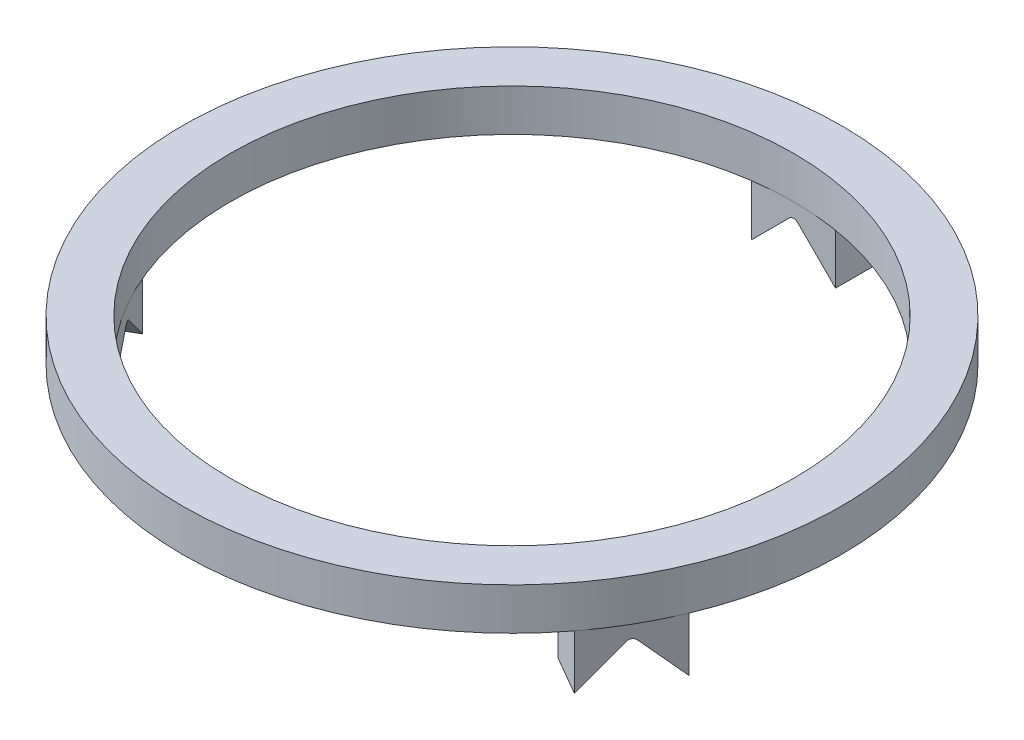
ISO-10303-21;
HEADER;
FILE_DESCRIPTION(('STEP AP214'),'2;1');
FILE_NAME('part.step','',(''),(''),'','','');
FILE_SCHEMA(('AUTOMOTIVE_DESIGN { 1 0 10303 214 1 1 1 1 }'));
ENDSEC;
DATA;
#1=APPLICATION_CONTEXT('core data for automotive mechanical design processes');
#2=APPLICATION_PROTOCOL_DEFINITION('international standard','automotive_design',2000,#1);
#3=PRODUCT_CONTEXT('',#1,'mechanical');
#4=PRODUCT('Part','Part','',(#3));
#5=PRODUCT_RELATED_PRODUCT_CATEGORY('part','',(#4));
#6=PRODUCT_DEFINITION_FORMATION('','',#4);
#7=PRODUCT_DEFINITION_CONTEXT('part definition',#1,'design');
#8=PRODUCT_DEFINITION('design','',#6,#7);
#9=PRODUCT_DEFINITION_SHAPE('','',#8);
#10=(LENGTH_UNIT() NAMED_UNIT(*) SI_UNIT(.MILLI.,.METRE.));
#11=(NAMED_UNIT(*) PLANE_ANGLE_UNIT() SI_UNIT($,.RADIAN.));
#12=(NAMED_UNIT(*) SI_UNIT($,.STERADIAN.) SOLID_ANGLE_UNIT());
#13=UNCERTAINTY_MEASURE_WITH_UNIT(LENGTH_MEASURE(1.E-05),#10,'distance_accuracy_value','');
#14=(GEOMETRIC_REPRESENTATION_CONTEXT(3) GLOBAL_UNCERTAINTY_ASSIGNED_CONTEXT((#13)) GLOBAL_UNIT_ASSIGNED_CONTEXT((#10,
#11,#12)) REPRESENTATION_CONTEXT('',''));
#15=CARTESIAN_POINT('',(0.,0.,0.));
#16=DIRECTION('',(0.,0.,1.));
#17=DIRECTION('',(1.,0.,0.));
#18=AXIS2_PLACEMENT_3D('',#15,#16,#17);
#19=CARTESIAN_POINT('',(0.,0.,0.));
#20=DIRECTION('',(0.,1.,0.));
#21=DIRECTION('',(0.,0.,1.));
#22=AXIS2_PLACEMENT_3D('',#19,#20,#21);
#23=PLANE('',#22);
#24=DIRECTION('',(0.866025403784442,0.,0.499999999999994));
#25=VECTOR('',#24,1.);
#26=CARTESIAN_POINT('',(12.888987999994,0.,5.38840313413997));
#27=LINE('',#26,#25);
#28=CARTESIAN_POINT('',(11.2276112703787,0.,4.42920683207116));
#29=VERTEX_POINT('',#28);
#30=CARTESIAN_POINT('',(12.888987999994,0.,5.38840313413997));
#31=VERTEX_POINT('',#30);
#32=EDGE_CURVE('E329',#29,#31,#27,.T.);
#33=ORIENTED_EDGE('',*,*,#32,.F.);
#34=DIRECTION('',(0.499999999999992,0.,-0.866025403784443));
#35=VECTOR('',#34,1.);
#36=CARTESIAN_POINT('',(10.3386112703787,0.,5.9689999999999));
#37=LINE('',#36,#35);
#38=CARTESIAN_POINT('',(10.3386112703787,0.,5.9689999999999));
#39=VERTEX_POINT('',#38);
#40=EDGE_CURVE('E335',#39,#29,#37,.T.);
#41=ORIENTED_EDGE('',*,*,#40,.F.);
#42=CARTESIAN_POINT('',(0.,0.,0.));
#43=DIRECTION('',(0.,1.,0.));
#44=DIRECTION('',(0.,0.,1.));
#45=AXIS2_PLACEMENT_3D('',#42,#43,#44);
#46=CIRCLE('',#45,11.938);
#47=CARTESIAN_POINT('',(0.,0.,-11.938));
#48=VERTEX_POINT('',#47);
#49=EDGE_CURVE('E268',#39,#48,#46,.T.);
#50=ORIENTED_EDGE('',*,*,#49,.T.);
#51=DIRECTION('',(-1.,0.,0.));
#52=VECTOR('',#51,1.);
#53=CARTESIAN_POINT('',(0.,0.,-11.938));
#54=LINE('',#53,#52);
#55=CARTESIAN_POINT('',(1.778,0.,-11.938));
#56=VERTEX_POINT('',#55);
#57=EDGE_CURVE('E243',#56,#48,#54,.T.);
#58=ORIENTED_EDGE('',*,*,#57,.F.);
#59=DIRECTION('',(0.,0.,1.));
#60=VECTOR('',#59,1.);
#61=CARTESIAN_POINT('',(1.778,0.,-11.938));
#62=LINE('',#61,#60);
#63=CARTESIAN_POINT('',(1.778,0.,-13.8563926041376));
#64=VERTEX_POINT('',#63);
#65=EDGE_CURVE('E251',#64,#56,#62,.T.);
#66=ORIENTED_EDGE('',*,*,#65,.F.);
#67=CARTESIAN_POINT('',(0.,0.,0.));
#68=DIRECTION('',(0.,1.,0.));
#69=DIRECTION('',(0.,0.,1.));
#70=AXIS2_PLACEMENT_3D('',#67,#68,#69);
#71=CIRCLE('',#70,13.97);
#72=EDGE_CURVE('E272',#31,#64,#71,.T.);
#73=ORIENTED_EDGE('',*,*,#72,.F.);
#74=EDGE_LOOP('',(#33,#41,#50,#58,#66,#73));
#75=FACE_BOUND('',#74,.T.);
#76=ADVANCED_FACE('F34',(#75),#23,.F.);
#77=DIRECTION('',(-0.499999999999992,0.,0.866025403784443));
#78=VECTOR('',#77,1.);
#79=CARTESIAN_POINT('',(11.1109879999941,0.,8.46798946999744));
#80=LINE('',#79,#78);
#81=CARTESIAN_POINT('',(11.1109879999941,0.,8.46798946999744));
#82=VERTEX_POINT('',#81);
#83=EDGE_CURVE('E333',#31,#82,#80,.T.);
#84=ORIENTED_EDGE('',*,*,#83,.F.);
#85=EDGE_CURVE('E429',#82,#31,#71,.T.);
#86=ORIENTED_EDGE('',*,*,#85,.F.);
#87=EDGE_LOOP('',(#84,#86));
#88=FACE_BOUND('',#87,.T.);
#89=ADVANCED_FACE('F402',(#88),#23,.F.);
#90=DIRECTION('',(-0.866025403784443,0.,-0.499999999999992));
#91=VECTOR('',#90,1.);
#92=CARTESIAN_POINT('',(9.4496112703787,0.,7.50879316792864));
#93=LINE('',#92,#91);
#94=CARTESIAN_POINT('',(9.44961127037869,0.,7.50879316792864));
#95=VERTEX_POINT('',#94);
#96=EDGE_CURVE('E184',#82,#95,#93,.T.);
#97=ORIENTED_EDGE('',*,*,#96,.F.);
#98=CARTESIAN_POINT('',(-11.110987999994,0.,8.46798946999756));
#99=VERTEX_POINT('',#98);
#100=EDGE_CURVE('E428',#99,#82,#71,.T.);
#101=ORIENTED_EDGE('',*,*,#100,.F.);
#102=DIRECTION('',(-0.866025403784438,0.,0.500000000000002));
#103=VECTOR('',#102,1.);
#104=CARTESIAN_POINT('',(-11.110987999994,0.,8.4679894699976));
#105=LINE('',#104,#103);
#106=CARTESIAN_POINT('',(-9.4496112703786,0.,7.50879316792878));
#107=VERTEX_POINT('',#106);
#108=EDGE_CURVE('E198',#107,#99,#105,.T.);
#109=ORIENTED_EDGE('',*,*,#108,.F.);
#110=DIRECTION('',(0.500000000000004,0.,0.866025403784436));
#111=VECTOR('',#110,1.);
#112=CARTESIAN_POINT('',(-10.3386112703786,0.,5.96900000000005));
#113=LINE('',#112,#111);
#114=CARTESIAN_POINT('',(-10.3386112703786,0.,5.96900000000005));
#115=VERTEX_POINT('',#114);
#116=EDGE_CURVE('E214',#115,#107,#113,.T.);
#117=ORIENTED_EDGE('',*,*,#116,.F.);
#118=EDGE_CURVE('E276',#115,#39,#46,.T.);
#119=ORIENTED_EDGE('',*,*,#118,.T.);
#120=EDGE_CURVE('E190',#95,#39,#37,.T.);
#121=ORIENTED_EDGE('',*,*,#120,.F.);
#122=EDGE_LOOP('',(#97,#101,#109,#117,#119,#121));
#123=FACE_BOUND('',#122,.T.);
#124=ADVANCED_FACE('F338',(#123),#23,.F.);
#125=DIRECTION('',(-0.500000000000004,0.,-0.866025403784436));
#126=VECTOR('',#125,1.);
#127=CARTESIAN_POINT('',(-12.888987999994,0.,5.38840313414014));
#128=LINE('',#127,#126);
#129=CARTESIAN_POINT('',(-12.888987999994,0.,5.38840313414014));
#130=VERTEX_POINT('',#129);
#131=EDGE_CURVE('E208',#99,#130,#128,.T.);
#132=ORIENTED_EDGE('',*,*,#131,.F.);
#133=EDGE_CURVE('E375',#130,#99,#71,.T.);
#134=ORIENTED_EDGE('',*,*,#133,.F.);
#135=EDGE_LOOP('',(#132,#134));
#136=FACE_BOUND('',#135,.T.);
#137=ADVANCED_FACE('F417',(#136),#23,.F.);
#138=DIRECTION('',(0.866025403784436,0.,-0.500000000000004));
#139=VECTOR('',#138,1.);
#140=CARTESIAN_POINT('',(-11.2276112703786,0.,4.42920683207132));
#141=LINE('',#140,#139);
#142=CARTESIAN_POINT('',(-11.2276112703786,0.,4.42920683207132));
#143=VERTEX_POINT('',#142);
#144=EDGE_CURVE('E211',#130,#143,#141,.T.);
#145=ORIENTED_EDGE('',*,*,#144,.F.);
#146=CARTESIAN_POINT('',(-1.778,0.,-13.8563926041376));
#147=VERTEX_POINT('',#146);
#148=EDGE_CURVE('E283',#147,#130,#71,.T.);
#149=ORIENTED_EDGE('',*,*,#148,.F.);
#150=DIRECTION('',(0.,0.,-1.));
#151=VECTOR('',#150,1.);
#152=CARTESIAN_POINT('',(-1.778,0.,-13.8563926041376));
#153=LINE('',#152,#151);
#154=CARTESIAN_POINT('',(-1.778,0.,-11.938));
#155=VERTEX_POINT('',#154);
#156=EDGE_CURVE('E238',#155,#147,#153,.T.);
#157=ORIENTED_EDGE('',*,*,#156,.F.);
#158=EDGE_CURVE('E256',#48,#155,#54,.T.);
#159=ORIENTED_EDGE('',*,*,#158,.F.);
#160=EDGE_CURVE('E273',#48,#115,#46,.T.);
#161=ORIENTED_EDGE('',*,*,#160,.T.);
#162=EDGE_CURVE('E203',#143,#115,#113,.T.);
#163=ORIENTED_EDGE('',*,*,#162,.F.);
#164=EDGE_LOOP('',(#145,#149,#157,#159,#161,#163));
#165=FACE_BOUND('',#164,.T.);
#166=ADVANCED_FACE('F351',(#165),#23,.F.);
#167=DIRECTION('',(1.,0.,0.));
#168=VECTOR('',#167,1.);
#169=CARTESIAN_POINT('',(1.778,0.,-13.8563926041376));
#170=LINE('',#169,#168);
#171=EDGE_CURVE('E248',#147,#64,#170,.T.);
#172=ORIENTED_EDGE('',*,*,#171,.F.);
#173=EDGE_CURVE('E280',#64,#147,#71,.T.);
#174=ORIENTED_EDGE('',*,*,#173,.F.);
#175=EDGE_LOOP('',(#172,#174));
#176=FACE_BOUND('',#175,.T.);
#177=ADVANCED_FACE('F370',(#176),#23,.F.);
#178=CARTESIAN_POINT('',(0.,1.778,0.));
#179=DIRECTION('',(0.,1.,0.));
#180=DIRECTION('',(0.,0.,1.));
#181=AXIS2_PLACEMENT_3D('',#178,#179,#180);
#182=PLANE('',#181);
#183=CARTESIAN_POINT('',(0.,1.778,0.));
#184=DIRECTION('',(0.,1.,0.));
#185=DIRECTION('',(0.,0.,1.));
#186=AXIS2_PLACEMENT_3D('',#183,#184,#185);
#187=CIRCLE('',#186,13.97);
#188=CARTESIAN_POINT('',(0.,1.778,13.97));
#189=VERTEX_POINT('',#188);
#190=EDGE_CURVE('E277',#189,#189,#187,.T.);
#191=ORIENTED_EDGE('',*,*,#190,.T.);
#192=EDGE_LOOP('',(#191));
#193=FACE_BOUND('',#192,.T.);
#194=CARTESIAN_POINT('',(0.,1.778,0.));
#195=DIRECTION('',(0.,1.,0.));
#196=DIRECTION('',(0.,0.,1.));
#197=AXIS2_PLACEMENT_3D('',#194,#195,#196);
#198=CIRCLE('',#197,11.938);
#199=CARTESIAN_POINT('',(0.,1.778,11.938));
#200=VERTEX_POINT('',#199);
#201=EDGE_CURVE('E269',#200,#200,#198,.T.);
#202=ORIENTED_EDGE('',*,*,#201,.F.);
#203=EDGE_LOOP('',(#202));
#204=FACE_BOUND('',#203,.T.);
#205=ADVANCED_FACE('F411',(#193,#204),#182,.T.);
#206=CARTESIAN_POINT('',(0.,1.778,0.));
#207=DIRECTION('',(0.,-1.,0.));
#208=DIRECTION('',(0.,0.,-1.));
#209=AXIS2_PLACEMENT_3D('',#206,#207,#208);
#210=CYLINDRICAL_SURFACE('',#209,13.97);
#211=ORIENTED_EDGE('',*,*,#190,.F.);
#212=EDGE_LOOP('',(#211));
#213=FACE_BOUND('',#212,.T.);
#214=ORIENTED_EDGE('',*,*,#173,.T.);
#215=ORIENTED_EDGE('',*,*,#148,.T.);
#216=ORIENTED_EDGE('',*,*,#133,.T.);
#217=ORIENTED_EDGE('',*,*,#100,.T.);
#218=ORIENTED_EDGE('',*,*,#85,.T.);
#219=ORIENTED_EDGE('',*,*,#72,.T.);
#220=EDGE_LOOP('',(#214,#215,#216,#217,#218,#219));
#221=FACE_BOUND('',#220,.T.);
#222=ADVANCED_FACE('F376',(#213,#221),#210,.T.);
#223=CARTESIAN_POINT('',(0.,1.778,0.));
#224=DIRECTION('',(0.,-1.,0.));
#225=DIRECTION('',(0.,0.,-1.));
#226=AXIS2_PLACEMENT_3D('',#223,#224,#225);
#227=CYLINDRICAL_SURFACE('',#226,11.938);
#228=ORIENTED_EDGE('',*,*,#201,.T.);
#229=EDGE_LOOP('',(#228));
#230=FACE_BOUND('',#229,.T.);
#231=ORIENTED_EDGE('',*,*,#160,.F.);
#232=ORIENTED_EDGE('',*,*,#49,.F.);
#233=ORIENTED_EDGE('',*,*,#118,.F.);
#234=EDGE_LOOP('',(#231,#232,#233));
#235=FACE_BOUND('',#234,.T.);
#236=ADVANCED_FACE('F355',(#230,#235),#227,.F.);
#237=CARTESIAN_POINT('',(-1.778,-2.286,-13.8563926041376));
#238=DIRECTION('',(1.,0.,0.));
#239=DIRECTION('',(0.,0.,-1.));
#240=AXIS2_PLACEMENT_3D('',#237,#238,#239);
#241=PLANE('',#240);
#242=ORIENTED_EDGE('',*,*,#156,.T.);
#243=DIRECTION('',(0.,1.,0.));
#244=VECTOR('',#243,1.);
#245=CARTESIAN_POINT('',(-1.778,-2.286,-13.8563926041376));
#246=LINE('',#245,#244);
#247=CARTESIAN_POINT('',(-1.778,-2.286,-13.8563926041376));
#248=VERTEX_POINT('',#247);
#249=EDGE_CURVE('E262',#248,#147,#246,.T.);
#250=ORIENTED_EDGE('',*,*,#249,.F.);
#251=DIRECTION('',(0.,0.,-1.));
#252=VECTOR('',#251,1.);
#253=CARTESIAN_POINT('',(-1.778,-2.286,-13.8563926041376));
#254=LINE('',#253,#252);
#255=CARTESIAN_POINT('',(-1.778,-2.286,-11.938));
#256=VERTEX_POINT('',#255);
#257=EDGE_CURVE('E239',#256,#248,#254,.T.);
#258=ORIENTED_EDGE('',*,*,#257,.F.);
#259=DIRECTION('',(0.,1.,0.));
#260=VECTOR('',#259,1.);
#261=CARTESIAN_POINT('',(-1.778,-2.286,-11.938));
#262=LINE('',#261,#260);
#263=EDGE_CURVE('E265',#256,#155,#262,.T.);
#264=ORIENTED_EDGE('',*,*,#263,.T.);
#265=EDGE_LOOP('',(#242,#250,#258,#264));
#266=FACE_BOUND('',#265,.T.);
#267=ADVANCED_FACE('F378',(#266),#241,.F.);
#268=CARTESIAN_POINT('',(1.778,-2.286,-13.8563926041376));
#269=DIRECTION('',(0.,0.,1.));
#270=DIRECTION('',(1.,0.,0.));
#271=AXIS2_PLACEMENT_3D('',#268,#269,#270);
#272=PLANE('',#271);
#273=DIRECTION('',(-0.707106781186546,0.707106781186549,0.));
#274=VECTOR('',#273,1.);
#275=CARTESIAN_POINT('',(1.778,-2.286,-13.8563926041376));
#276=LINE('',#275,#274);
#277=CARTESIAN_POINT('',(1.778,-2.286,-13.8563926041376));
#278=VERTEX_POINT('',#277);
#279=CARTESIAN_POINT('',(0.179605122421383,-0.687605122421378,-13.8563926041376));
#280=VERTEX_POINT('',#279);
#281=EDGE_CURVE('E233',#278,#280,#276,.T.);
#282=ORIENTED_EDGE('',*,*,#281,.T.);
#283=CARTESIAN_POINT('',(0.,-0.86721024484276,-13.8563926041376));
#284=DIRECTION('',(0.,0.,1.));
#285=DIRECTION('',(1.,0.,0.));
#286=AXIS2_PLACEMENT_3D('',#283,#284,#285);
#287=CIRCLE('',#286,0.254);
#288=CARTESIAN_POINT('',(-0.179605122421383,-0.687605122421378,-13.8563926041376));
#289=VERTEX_POINT('',#288);
#290=EDGE_CURVE('E291',#280,#289,#287,.T.);
#291=ORIENTED_EDGE('',*,*,#290,.T.);
#292=DIRECTION('',(-0.707106781186546,-0.707106781186549,0.));
#293=VECTOR('',#292,1.);
#294=CARTESIAN_POINT('',(0.,-0.508,-13.8563926041376));
#295=LINE('',#294,#293);
#296=EDGE_CURVE('E236',#289,#248,#295,.T.);
#297=ORIENTED_EDGE('',*,*,#296,.T.);
#298=ORIENTED_EDGE('',*,*,#249,.T.);
#299=ORIENTED_EDGE('',*,*,#171,.T.);
#300=DIRECTION('',(0.,1.,0.));
#301=VECTOR('',#300,1.);
#302=CARTESIAN_POINT('',(1.778,-2.286,-13.8563926041376));
#303=LINE('',#302,#301);
#304=EDGE_CURVE('E259',#278,#64,#303,.T.);
#305=ORIENTED_EDGE('',*,*,#304,.F.);
#306=EDGE_LOOP('',(#282,#291,#297,#298,#299,#305));
#307=FACE_BOUND('',#306,.T.);
#308=ADVANCED_FACE('F366',(#307),#272,.F.);
#309=CARTESIAN_POINT('',(1.778,-2.286,-11.938));
#310=DIRECTION('',(-1.,0.,0.));
#311=DIRECTION('',(0.,0.,1.));
#312=AXIS2_PLACEMENT_3D('',#309,#310,#311);
#313=PLANE('',#312);
#314=ORIENTED_EDGE('',*,*,#65,.T.);
#315=DIRECTION('',(0.,1.,0.));
#316=VECTOR('',#315,1.);
#317=CARTESIAN_POINT('',(1.778,-2.286,-11.938));
#318=LINE('',#317,#316);
#319=CARTESIAN_POINT('',(1.778,-2.286,-11.938));
#320=VERTEX_POINT('',#319);
#321=EDGE_CURVE('E245',#320,#56,#318,.T.);
#322=ORIENTED_EDGE('',*,*,#321,.F.);
#323=DIRECTION('',(0.,0.,1.));
#324=VECTOR('',#323,1.);
#325=CARTESIAN_POINT('',(1.778,-2.286,-11.938));
#326=LINE('',#325,#324);
#327=EDGE_CURVE('E242',#278,#320,#326,.T.);
#328=ORIENTED_EDGE('',*,*,#327,.F.);
#329=ORIENTED_EDGE('',*,*,#304,.T.);
#330=EDGE_LOOP('',(#314,#322,#328,#329));
#331=FACE_BOUND('',#330,.T.);
#332=ADVANCED_FACE('F361',(#331),#313,.F.);
#333=CARTESIAN_POINT('',(0.,-2.286,-11.938));
#334=DIRECTION('',(0.,0.,-1.));
#335=DIRECTION('',(-1.,0.,0.));
#336=AXIS2_PLACEMENT_3D('',#333,#334,#335);
#337=PLANE('',#336);
#338=ORIENTED_EDGE('',*,*,#263,.F.);
#339=DIRECTION('',(-0.707106781186546,-0.707106781186549,0.));
#340=VECTOR('',#339,1.);
#341=CARTESIAN_POINT('',(-1.778,-2.286,-11.938));
#342=LINE('',#341,#340);
#343=CARTESIAN_POINT('',(-0.179605122421383,-0.687605122421378,-11.938));
#344=VERTEX_POINT('',#343);
#345=EDGE_CURVE('E231',#344,#256,#342,.T.);
#346=ORIENTED_EDGE('',*,*,#345,.F.);
#347=CARTESIAN_POINT('',(0.,-0.86721024484276,-11.938));
#348=DIRECTION('',(0.,0.,-1.));
#349=DIRECTION('',(-1.,0.,0.));
#350=AXIS2_PLACEMENT_3D('',#347,#348,#349);
#351=CIRCLE('',#350,0.254);
#352=CARTESIAN_POINT('',(0.179605122421383,-0.687605122421378,-11.938));
#353=VERTEX_POINT('',#352);
#354=EDGE_CURVE('E289',#344,#353,#351,.T.);
#355=ORIENTED_EDGE('',*,*,#354,.T.);
#356=DIRECTION('',(-0.707106781186546,0.707106781186549,0.));
#357=VECTOR('',#356,1.);
#358=CARTESIAN_POINT('',(0.,-0.507999999999994,-11.938));
#359=LINE('',#358,#357);
#360=EDGE_CURVE('E228',#320,#353,#359,.T.);
#361=ORIENTED_EDGE('',*,*,#360,.F.);
#362=ORIENTED_EDGE('',*,*,#321,.T.);
#363=ORIENTED_EDGE('',*,*,#57,.T.);
#364=ORIENTED_EDGE('',*,*,#158,.T.);
#365=EDGE_LOOP('',(#338,#346,#355,#361,#362,#363,#364));
#366=FACE_BOUND('',#365,.T.);
#367=ADVANCED_FACE('F356',(#366),#337,.F.);
#368=CARTESIAN_POINT('',(-1.778,-2.286,-14.478));
#369=DIRECTION('',(-0.707106781186549,0.707106781186546,0.));
#370=DIRECTION('',(-0.707106781186546,-0.707106781186549,0.));
#371=AXIS2_PLACEMENT_3D('',#368,#369,#370);
#372=PLANE('',#371);
#373=ORIENTED_EDGE('',*,*,#296,.F.);
#374=DIRECTION('',(0.,0.,1.));
#375=VECTOR('',#374,1.);
#376=CARTESIAN_POINT('',(-0.179605122421383,-0.687605122421378,-11.938));
#377=LINE('',#376,#375);
#378=EDGE_CURVE('E284',#289,#344,#377,.T.);
#379=ORIENTED_EDGE('',*,*,#378,.T.);
#380=ORIENTED_EDGE('',*,*,#345,.T.);
#381=ORIENTED_EDGE('',*,*,#257,.T.);
#382=EDGE_LOOP('',(#373,#379,#380,#381));
#383=FACE_BOUND('',#382,.T.);
#384=ADVANCED_FACE('F383',(#383),#372,.F.);
#385=CARTESIAN_POINT('',(0.,-0.507999999999994,-14.478));
#386=DIRECTION('',(0.707106781186549,0.707106781186546,0.));
#387=DIRECTION('',(-0.707106781186546,0.707106781186549,0.));
#388=AXIS2_PLACEMENT_3D('',#385,#386,#387);
#389=PLANE('',#388);
#390=ORIENTED_EDGE('',*,*,#360,.T.);
#391=DIRECTION('',(0.,0.,1.));
#392=VECTOR('',#391,1.);
#393=CARTESIAN_POINT('',(0.179605122421383,-0.687605122421378,-13.8563926041376));
#394=LINE('',#393,#392);
#395=EDGE_CURVE('E287',#353,#280,#394,.F.);
#396=ORIENTED_EDGE('',*,*,#395,.T.);
#397=ORIENTED_EDGE('',*,*,#281,.F.);
#398=ORIENTED_EDGE('',*,*,#327,.T.);
#399=EDGE_LOOP('',(#390,#396,#397,#398));
#400=FACE_BOUND('',#399,.T.);
#401=ADVANCED_FACE('F390',(#400),#389,.F.);
#402=CARTESIAN_POINT('',(0.,-0.86721024484276,-14.478));
#403=DIRECTION('',(0.,0.,-1.));
#404=DIRECTION('',(-1.,0.,0.));
#405=AXIS2_PLACEMENT_3D('',#402,#403,#404);
#406=CYLINDRICAL_SURFACE('',#405,0.254);
#407=ORIENTED_EDGE('',*,*,#290,.F.);
#408=ORIENTED_EDGE('',*,*,#395,.F.);
#409=ORIENTED_EDGE('',*,*,#354,.F.);
#410=ORIENTED_EDGE('',*,*,#378,.F.);
#411=EDGE_LOOP('',(#407,#408,#409,#410));
#412=FACE_BOUND('',#411,.T.);
#413=ADVANCED_FACE('F387',(#412),#406,.F.);
#414=CARTESIAN_POINT('',(-11.110987999994,-2.286,8.4679894699976));
#415=DIRECTION('',(-0.500000000000002,0.,-0.866025403784438));
#416=DIRECTION('',(-0.866025403784438,0.,0.500000000000002));
#417=AXIS2_PLACEMENT_3D('',#414,#415,#416);
#418=PLANE('',#417);
#419=ORIENTED_EDGE('',*,*,#108,.T.);
#420=DIRECTION('',(0.,1.,0.));
#421=VECTOR('',#420,1.);
#422=CARTESIAN_POINT('',(-11.110987999994,-2.286,8.4679894699976));
#423=LINE('',#422,#421);
#424=CARTESIAN_POINT('',(-11.110987999994,-2.286,8.4679894699976));
#425=VERTEX_POINT('',#424);
#426=EDGE_CURVE('E222',#425,#99,#423,.T.);
#427=ORIENTED_EDGE('',*,*,#426,.F.);
#428=DIRECTION('',(-0.866025403784438,0.,0.500000000000002));
#429=VECTOR('',#428,1.);
#430=CARTESIAN_POINT('',(-11.110987999994,-2.286,8.4679894699976));
#431=LINE('',#430,#429);
#432=CARTESIAN_POINT('',(-9.4496112703786,-2.286,7.50879316792878));
#433=VERTEX_POINT('',#432);
#434=EDGE_CURVE('E199',#433,#425,#431,.T.);
#435=ORIENTED_EDGE('',*,*,#434,.F.);
#436=DIRECTION('',(0.,1.,0.));
#437=VECTOR('',#436,1.);
#438=CARTESIAN_POINT('',(-9.4496112703786,-2.286,7.50879316792878));
#439=LINE('',#438,#437);
#440=EDGE_CURVE('E225',#433,#107,#439,.T.);
#441=ORIENTED_EDGE('',*,*,#440,.T.);
#442=EDGE_LOOP('',(#419,#427,#435,#441));
#443=FACE_BOUND('',#442,.T.);
#444=ADVANCED_FACE('F397',(#443),#418,.F.);
#445=CARTESIAN_POINT('',(-12.888987999994,-2.286,5.38840313414014));
#446=DIRECTION('',(0.866025403784436,0.,-0.500000000000004));
#447=DIRECTION('',(-0.500000000000004,0.,-0.866025403784436));
#448=AXIS2_PLACEMENT_3D('',#445,#446,#447);
#449=PLANE('',#448);
#450=DIRECTION('',(0.353553390593276,0.707106781186549,0.612372435695792));
#451=VECTOR('',#450,1.);
#452=CARTESIAN_POINT('',(-12.888987999994,-2.286,5.38840313414014));
#453=LINE('',#452,#451);
#454=CARTESIAN_POINT('',(-12.888987999994,-2.286,5.38840313414014));
#455=VERTEX_POINT('',#454);
#456=CARTESIAN_POINT('',(-12.0897905612047,-0.687605122421378,6.77265370340214));
#457=VERTEX_POINT('',#456);
#458=EDGE_CURVE('E324',#455,#457,#453,.T.);
#459=ORIENTED_EDGE('',*,*,#458,.T.);
#460=CARTESIAN_POINT('',(-11.999987999994,-0.867210244842761,6.92819630206887));
#461=DIRECTION('',(0.866025403784436,0.,-0.500000000000004));
#462=DIRECTION('',(-0.500000000000004,0.,-0.866025403784436));
#463=AXIS2_PLACEMENT_3D('',#460,#461,#462);
#464=CIRCLE('',#463,0.254);
#465=CARTESIAN_POINT('',(-11.9101854387833,-0.687605122421378,7.0837389007356));
#466=VERTEX_POINT('',#465);
#467=EDGE_CURVE('E300',#457,#466,#464,.T.);
#468=ORIENTED_EDGE('',*,*,#467,.T.);
#469=DIRECTION('',(0.353553390593276,-0.707106781186549,0.612372435695792));
#470=VECTOR('',#469,1.);
#471=CARTESIAN_POINT('',(-11.999987999994,-0.507999999999999,6.92819630206888));
#472=LINE('',#471,#470);
#473=EDGE_CURVE('E327',#466,#425,#472,.T.);
#474=ORIENTED_EDGE('',*,*,#473,.T.);
#475=ORIENTED_EDGE('',*,*,#426,.T.);
#476=ORIENTED_EDGE('',*,*,#131,.T.);
#477=DIRECTION('',(0.,1.,0.));
#478=VECTOR('',#477,1.);
#479=CARTESIAN_POINT('',(-12.888987999994,-2.286,5.38840313414014));
#480=LINE('',#479,#478);
#481=EDGE_CURVE('E219',#455,#130,#480,.T.);
#482=ORIENTED_EDGE('',*,*,#481,.F.);
#483=EDGE_LOOP('',(#459,#468,#474,#475,#476,#482));
#484=FACE_BOUND('',#483,.T.);
#485=ADVANCED_FACE('F434',(#484),#449,.F.);
#486=CARTESIAN_POINT('',(-11.2276112703786,-2.286,4.42920683207132));
#487=DIRECTION('',(0.500000000000004,0.,0.866025403784436));
#488=DIRECTION('',(0.866025403784436,0.,-0.500000000000004));
#489=AXIS2_PLACEMENT_3D('',#486,#487,#488);
#490=PLANE('',#489);
#491=ORIENTED_EDGE('',*,*,#144,.T.);
#492=DIRECTION('',(0.,1.,0.));
#493=VECTOR('',#492,1.);
#494=CARTESIAN_POINT('',(-11.2276112703786,-2.286,4.42920683207132));
#495=LINE('',#494,#493);
#496=CARTESIAN_POINT('',(-11.2276112703786,-2.286,4.42920683207132));
#497=VERTEX_POINT('',#496);
#498=EDGE_CURVE('E205',#497,#143,#495,.T.);
#499=ORIENTED_EDGE('',*,*,#498,.F.);
#500=DIRECTION('',(0.866025403784436,0.,-0.500000000000004));
#501=VECTOR('',#500,1.);
#502=CARTESIAN_POINT('',(-11.2276112703786,-2.286,4.42920683207132));
#503=LINE('',#502,#501);
#504=EDGE_CURVE('E202',#455,#497,#503,.T.);
#505=ORIENTED_EDGE('',*,*,#504,.F.);
#506=ORIENTED_EDGE('',*,*,#481,.T.);
#507=EDGE_LOOP('',(#491,#499,#505,#506));
#508=FACE_BOUND('',#507,.T.);
#509=ADVANCED_FACE('F446',(#508),#490,.F.);
#510=CARTESIAN_POINT('',(-10.3386112703786,-2.286,5.96900000000005));
#511=DIRECTION('',(-0.866025403784436,0.,0.500000000000004));
#512=DIRECTION('',(0.500000000000004,0.,0.866025403784436));
#513=AXIS2_PLACEMENT_3D('',#510,#511,#512);
#514=PLANE('',#513);
#515=ORIENTED_EDGE('',*,*,#440,.F.);
#516=DIRECTION('',(0.353553390593276,-0.707106781186549,0.612372435695792));
#517=VECTOR('',#516,1.);
#518=CARTESIAN_POINT('',(-9.4496112703786,-2.286,7.50879316792878));
#519=LINE('',#518,#517);
#520=CARTESIAN_POINT('',(-10.2488087091679,-0.687605122421377,6.12454259866678));
#521=VERTEX_POINT('',#520);
#522=EDGE_CURVE('E322',#521,#433,#519,.T.);
#523=ORIENTED_EDGE('',*,*,#522,.F.);
#524=CARTESIAN_POINT('',(-10.3386112703786,-0.867210244842761,5.96900000000005));
#525=DIRECTION('',(-0.866025403784436,0.,0.500000000000004));
#526=DIRECTION('',(0.500000000000004,0.,0.866025403784436));
#527=AXIS2_PLACEMENT_3D('',#524,#525,#526);
#528=CIRCLE('',#527,0.254);
#529=CARTESIAN_POINT('',(-10.4284138315893,-0.687605122421378,5.81345740133332));
#530=VERTEX_POINT('',#529);
#531=EDGE_CURVE('E298',#521,#530,#528,.T.);
#532=ORIENTED_EDGE('',*,*,#531,.T.);
#533=DIRECTION('',(0.353553390593276,0.707106781186549,0.612372435695792));
#534=VECTOR('',#533,1.);
#535=CARTESIAN_POINT('',(-10.3386112703786,-0.507999999999994,5.96900000000005));
#536=LINE('',#535,#534);
#537=EDGE_CURVE('E319',#497,#530,#536,.T.);
#538=ORIENTED_EDGE('',*,*,#537,.F.);
#539=ORIENTED_EDGE('',*,*,#498,.T.);
#540=ORIENTED_EDGE('',*,*,#162,.T.);
#541=ORIENTED_EDGE('',*,*,#116,.T.);
#542=EDGE_LOOP('',(#515,#523,#532,#538,#539,#540,#541));
#543=FACE_BOUND('',#542,.T.);
#544=ADVANCED_FACE('F442',(#543),#514,.F.);
#545=CARTESIAN_POINT('',(12.888987999994,-2.286,5.38840313413997));
#546=DIRECTION('',(-0.499999999999994,0.,0.866025403784442));
#547=DIRECTION('',(0.866025403784442,0.,0.499999999999994));
#548=AXIS2_PLACEMENT_3D('',#545,#546,#547);
#549=PLANE('',#548);
#550=ORIENTED_EDGE('',*,*,#32,.T.);
#551=DIRECTION('',(0.,1.,0.));
#552=VECTOR('',#551,1.);
#553=CARTESIAN_POINT('',(12.888987999994,-2.286,5.38840313413997));
#554=LINE('',#553,#552);
#555=CARTESIAN_POINT('',(12.888987999994,-2.286,5.38840313413996));
#556=VERTEX_POINT('',#555);
#557=EDGE_CURVE('E187',#556,#31,#554,.T.);
#558=ORIENTED_EDGE('',*,*,#557,.F.);
#559=DIRECTION('',(0.866025403784442,0.,0.499999999999994));
#560=VECTOR('',#559,1.);
#561=CARTESIAN_POINT('',(12.888987999994,-2.286,5.38840313413997));
#562=LINE('',#561,#560);
#563=CARTESIAN_POINT('',(11.2276112703787,-2.286,4.42920683207116));
#564=VERTEX_POINT('',#563);
#565=EDGE_CURVE('E174',#564,#556,#562,.T.);
#566=ORIENTED_EDGE('',*,*,#565,.F.);
#567=DIRECTION('',(0.,1.,0.));
#568=VECTOR('',#567,1.);
#569=CARTESIAN_POINT('',(11.2276112703787,-2.286,4.42920683207116));
#570=LINE('',#569,#568);
#571=EDGE_CURVE('E195',#564,#29,#570,.T.);
#572=ORIENTED_EDGE('',*,*,#571,.T.);
#573=EDGE_LOOP('',(#550,#558,#566,#572));
#574=FACE_BOUND('',#573,.T.);
#575=ADVANCED_FACE('F470',(#574),#549,.F.);
#576=CARTESIAN_POINT('',(11.1109879999941,-2.286,8.46798946999744));
#577=DIRECTION('',(-0.866025403784443,0.,-0.499999999999992));
#578=DIRECTION('',(-0.499999999999992,0.,0.866025403784443));
#579=AXIS2_PLACEMENT_3D('',#576,#577,#578);
#580=PLANE('',#579);
#581=DIRECTION('',(0.353553390593267,0.707106781186549,-0.612372435695797));
#582=VECTOR('',#581,1.);
#583=CARTESIAN_POINT('',(11.1109879999941,-2.286,8.46798946999744));
#584=LINE('',#583,#582);
#585=CARTESIAN_POINT('',(11.1109879999941,-2.286,8.46798946999744));
#586=VERTEX_POINT('',#585);
#587=CARTESIAN_POINT('',(11.9101854387834,-0.687605122421378,7.08373890073544));
#588=VERTEX_POINT('',#587);
#589=EDGE_CURVE('E168',#586,#588,#584,.T.);
#590=ORIENTED_EDGE('',*,*,#589,.T.);
#591=CARTESIAN_POINT('',(11.9999879999941,-0.867210244842761,6.9281963020687));
#592=DIRECTION('',(-0.866025403784443,0.,-0.499999999999992));
#593=DIRECTION('',(-0.499999999999992,0.,0.866025403784443));
#594=AXIS2_PLACEMENT_3D('',#591,#592,#593);
#595=CIRCLE('',#594,0.254);
#596=CARTESIAN_POINT('',(12.0897905612048,-0.687605122421378,6.77265370340197));
#597=VERTEX_POINT('',#596);
#598=EDGE_CURVE('E11',#588,#597,#595,.T.);
#599=ORIENTED_EDGE('',*,*,#598,.T.);
#600=DIRECTION('',(0.353553390593267,-0.707106781186549,-0.612372435695797));
#601=VECTOR('',#600,1.);
#602=CARTESIAN_POINT('',(11.9999879999941,-0.508,6.9281963020687));
#603=LINE('',#602,#601);
#604=EDGE_CURVE('E311',#597,#556,#603,.T.);
#605=ORIENTED_EDGE('',*,*,#604,.T.);
#606=ORIENTED_EDGE('',*,*,#557,.T.);
#607=ORIENTED_EDGE('',*,*,#83,.T.);
#608=DIRECTION('',(0.,1.,0.));
#609=VECTOR('',#608,1.);
#610=CARTESIAN_POINT('',(11.1109879999941,-2.286,8.46798946999744));
#611=LINE('',#610,#609);
#612=EDGE_CURVE('E185',#586,#82,#611,.T.);
#613=ORIENTED_EDGE('',*,*,#612,.F.);
#614=EDGE_LOOP('',(#590,#599,#605,#606,#607,#613));
#615=FACE_BOUND('',#614,.T.);
#616=ADVANCED_FACE('F467',(#615),#580,.F.);
#617=CARTESIAN_POINT('',(9.4496112703787,-2.286,7.50879316792864));
#618=DIRECTION('',(0.499999999999992,0.,-0.866025403784443));
#619=DIRECTION('',(-0.866025403784443,0.,-0.499999999999992));
#620=AXIS2_PLACEMENT_3D('',#617,#618,#619);
#621=PLANE('',#620);
#622=ORIENTED_EDGE('',*,*,#96,.T.);
#623=DIRECTION('',(0.,1.,0.));
#624=VECTOR('',#623,1.);
#625=CARTESIAN_POINT('',(9.4496112703787,-2.286,7.50879316792864));
#626=LINE('',#625,#624);
#627=CARTESIAN_POINT('',(9.4496112703787,-2.286,7.50879316792864));
#628=VERTEX_POINT('',#627);
#629=EDGE_CURVE('E173',#628,#95,#626,.T.);
#630=ORIENTED_EDGE('',*,*,#629,.F.);
#631=DIRECTION('',(-0.866025403784443,0.,-0.499999999999992));
#632=VECTOR('',#631,1.);
#633=CARTESIAN_POINT('',(9.4496112703787,-2.286,7.50879316792864));
#634=LINE('',#633,#632);
#635=EDGE_CURVE('E165',#586,#628,#634,.T.);
#636=ORIENTED_EDGE('',*,*,#635,.F.);
#637=ORIENTED_EDGE('',*,*,#612,.T.);
#638=EDGE_LOOP('',(#622,#630,#636,#637));
#639=FACE_BOUND('',#638,.T.);
#640=ADVANCED_FACE('F183',(#639),#621,.F.);
#641=CARTESIAN_POINT('',(10.3386112703787,-2.286,5.9689999999999));
#642=DIRECTION('',(0.866025403784443,0.,0.499999999999992));
#643=DIRECTION('',(0.499999999999992,0.,-0.866025403784443));
#644=AXIS2_PLACEMENT_3D('',#641,#642,#643);
#645=PLANE('',#644);
#646=ORIENTED_EDGE('',*,*,#571,.F.);
#647=DIRECTION('',(0.353553390593267,-0.707106781186549,-0.612372435695797));
#648=VECTOR('',#647,1.);
#649=CARTESIAN_POINT('',(11.2276112703787,-2.286,4.42920683207116));
#650=LINE('',#649,#648);
#651=CARTESIAN_POINT('',(10.4284138315894,-0.687605122421379,5.81345740133317));
#652=VERTEX_POINT('',#651);
#653=EDGE_CURVE('E180',#652,#564,#650,.T.);
#654=ORIENTED_EDGE('',*,*,#653,.F.);
#655=CARTESIAN_POINT('',(10.3386112703787,-0.867210244842761,5.9689999999999));
#656=DIRECTION('',(0.866025403784443,0.,0.499999999999992));
#657=DIRECTION('',(0.499999999999992,0.,-0.866025403784443));
#658=AXIS2_PLACEMENT_3D('',#655,#656,#657);
#659=CIRCLE('',#658,0.254);
#660=CARTESIAN_POINT('',(10.248808709168,-0.687605122421378,6.12454259866664));
#661=VERTEX_POINT('',#660);
#662=EDGE_CURVE('E42',#652,#661,#659,.T.);
#663=ORIENTED_EDGE('',*,*,#662,.T.);
#664=DIRECTION('',(0.353553390593267,0.707106781186549,-0.612372435695797));
#665=VECTOR('',#664,1.);
#666=CARTESIAN_POINT('',(10.3386112703787,-0.507999999999994,5.9689999999999));
#667=LINE('',#666,#665);
#668=EDGE_CURVE('E167',#628,#661,#667,.T.);
#669=ORIENTED_EDGE('',*,*,#668,.F.);
#670=ORIENTED_EDGE('',*,*,#629,.T.);
#671=ORIENTED_EDGE('',*,*,#120,.T.);
#672=ORIENTED_EDGE('',*,*,#40,.T.);
#673=EDGE_LOOP('',(#646,#654,#663,#669,#670,#671,#672));
#674=FACE_BOUND('',#673,.T.);
#675=ADVANCED_FACE('F178',(#674),#645,.F.);
#676=CARTESIAN_POINT('',(-11.6493157959911,-2.286,8.77879316792879));
#677=DIRECTION('',(0.353553390593277,0.707106781186546,0.612372435695794));
#678=DIRECTION('',(0.,-0.654653670707977,0.755928946018454));
#679=AXIS2_PLACEMENT_3D('',#676,#677,#678);
#680=PLANE('',#679);
#681=ORIENTED_EDGE('',*,*,#473,.F.);
#682=DIRECTION('',(0.866025403784436,0.,-0.500000000000004));
#683=VECTOR('',#682,1.);
#684=CARTESIAN_POINT('',(-10.2488087091679,-0.687605122421378,6.12454259866678));
#685=LINE('',#684,#683);
#686=EDGE_CURVE('E293',#466,#521,#685,.T.);
#687=ORIENTED_EDGE('',*,*,#686,.T.);
#688=ORIENTED_EDGE('',*,*,#522,.T.);
#689=ORIENTED_EDGE('',*,*,#434,.T.);
#690=EDGE_LOOP('',(#681,#687,#688,#689));
#691=FACE_BOUND('',#690,.T.);
#692=ADVANCED_FACE('F439',(#691),#680,.F.);
#693=CARTESIAN_POINT('',(-12.5383157959911,-0.507999999999994,7.23900000000006));
#694=DIRECTION('',(-0.353553390593277,0.707106781186546,-0.612372435695794));
#695=DIRECTION('',(0.,0.654653670707977,0.755928946018454));
#696=AXIS2_PLACEMENT_3D('',#693,#694,#695);
#697=PLANE('',#696);
#698=ORIENTED_EDGE('',*,*,#537,.T.);
#699=DIRECTION('',(0.866025403784436,0.,-0.500000000000004));
#700=VECTOR('',#699,1.);
#701=CARTESIAN_POINT('',(-12.0897905612047,-0.687605122421378,6.77265370340214));
#702=LINE('',#701,#700);
#703=EDGE_CURVE('E296',#530,#457,#702,.F.);
#704=ORIENTED_EDGE('',*,*,#703,.T.);
#705=ORIENTED_EDGE('',*,*,#458,.F.);
#706=ORIENTED_EDGE('',*,*,#504,.T.);
#707=EDGE_LOOP('',(#698,#704,#705,#706));
#708=FACE_BOUND('',#707,.T.);
#709=ADVANCED_FACE('F452',(#708),#697,.F.);
#710=CARTESIAN_POINT('',(13.4273157959912,-2.286,5.69920683207114));
#711=DIRECTION('',(0.353553390593269,0.707106781186546,-0.612372435695799));
#712=DIRECTION('',(0.,0.654653670707981,0.755928946018452));
#713=AXIS2_PLACEMENT_3D('',#710,#711,#712);
#714=PLANE('',#713);
#715=ORIENTED_EDGE('',*,*,#604,.F.);
#716=DIRECTION('',(-0.866025403784443,0.,-0.499999999999992));
#717=VECTOR('',#716,1.);
#718=CARTESIAN_POINT('',(10.4284138315894,-0.687605122421378,5.81345740133317));
#719=LINE('',#718,#717);
#720=EDGE_CURVE('E302',#597,#652,#719,.T.);
#721=ORIENTED_EDGE('',*,*,#720,.T.);
#722=ORIENTED_EDGE('',*,*,#653,.T.);
#723=ORIENTED_EDGE('',*,*,#565,.T.);
#724=EDGE_LOOP('',(#715,#721,#722,#723));
#725=FACE_BOUND('',#724,.T.);
#726=ADVANCED_FACE('F308',(#725),#714,.F.);
#727=CARTESIAN_POINT('',(12.5383157959912,-0.507999999999994,7.23899999999988));
#728=DIRECTION('',(-0.353553390593269,0.707106781186546,0.612372435695799));
#729=DIRECTION('',(0.,-0.654653670707981,0.755928946018452));
#730=AXIS2_PLACEMENT_3D('',#727,#728,#729);
#731=PLANE('',#730);
#732=ORIENTED_EDGE('',*,*,#668,.T.);
#733=DIRECTION('',(-0.866025403784443,0.,-0.499999999999992));
#734=VECTOR('',#733,1.);
#735=CARTESIAN_POINT('',(11.9101854387834,-0.687605122421378,7.08373890073544));
#736=LINE('',#735,#734);
#737=EDGE_CURVE('E49',#661,#588,#736,.F.);
#738=ORIENTED_EDGE('',*,*,#737,.T.);
#739=ORIENTED_EDGE('',*,*,#589,.F.);
#740=ORIENTED_EDGE('',*,*,#635,.T.);
#741=EDGE_LOOP('',(#732,#738,#739,#740));
#742=FACE_BOUND('',#741,.T.);
#743=ADVANCED_FACE('F166',(#742),#731,.F.);
#744=CARTESIAN_POINT('',(-12.5383157959911,-0.867210244842761,7.23900000000006));
#745=DIRECTION('',(-0.866025403784436,0.,0.500000000000004));
#746=DIRECTION('',(0.500000000000004,0.,0.866025403784436));
#747=AXIS2_PLACEMENT_3D('',#744,#745,#746);
#748=CYLINDRICAL_SURFACE('',#747,0.254);
#749=ORIENTED_EDGE('',*,*,#467,.F.);
#750=ORIENTED_EDGE('',*,*,#703,.F.);
#751=ORIENTED_EDGE('',*,*,#531,.F.);
#752=ORIENTED_EDGE('',*,*,#686,.F.);
#753=EDGE_LOOP('',(#749,#750,#751,#752));
#754=FACE_BOUND('',#753,.T.);
#755=ADVANCED_FACE('F451',(#754),#748,.F.);
#756=CARTESIAN_POINT('',(12.5383157959912,-0.867210244842761,7.23899999999988));
#757=DIRECTION('',(0.866025403784443,0.,0.499999999999992));
#758=DIRECTION('',(0.499999999999992,0.,-0.866025403784443));
#759=AXIS2_PLACEMENT_3D('',#756,#757,#758);
#760=CYLINDRICAL_SURFACE('',#759,0.254);
#761=ORIENTED_EDGE('',*,*,#598,.F.);
#762=ORIENTED_EDGE('',*,*,#737,.F.);
#763=ORIENTED_EDGE('',*,*,#662,.F.);
#764=ORIENTED_EDGE('',*,*,#720,.F.);
#765=EDGE_LOOP('',(#761,#762,#763,#764));
#766=FACE_BOUND('',#765,.T.);
#767=ADVANCED_FACE('F36',(#766),#760,.F.);
#768=CLOSED_SHELL('',(#76,#89,#124,#137,#166,#177,#205,#222,#236,#267,#308,#332,#367,#384,#401,
#413,#444,#485,#509,#544,#575,#616,#640,#675,#692,#709,#726,#743,#755,#767));
#769=MANIFOLD_SOLID_BREP('B2',#768);
#770=ADVANCED_BREP_SHAPE_REPRESENTATION('',(#18,#769),#14);
#771=SHAPE_DEFINITION_REPRESENTATION(#9,#770);
ENDSEC;
END-ISO-10303-21;
